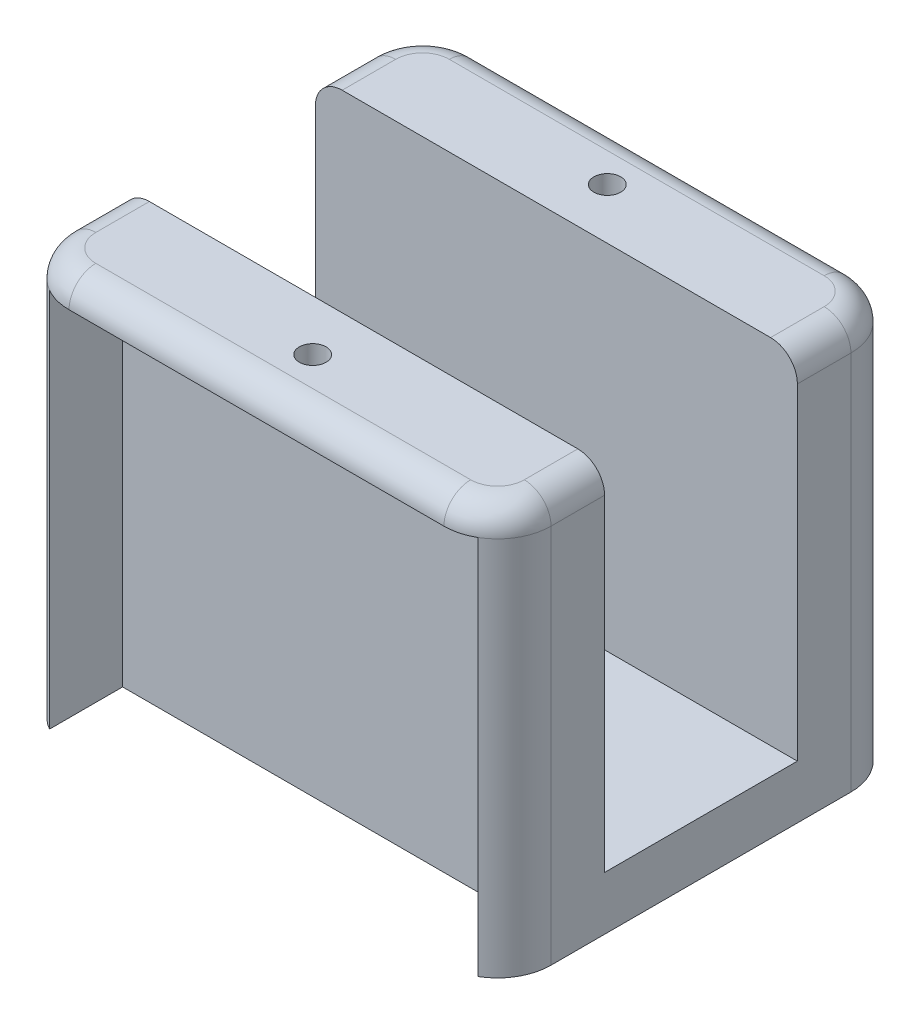
ISO-10303-21;
HEADER;
FILE_DESCRIPTION(('STEP AP214'),'2;1');
FILE_NAME('part.step','',(''),(''),'','','');
FILE_SCHEMA(('AUTOMOTIVE_DESIGN { 1 0 10303 214 1 1 1 1 }'));
ENDSEC;
DATA;
#1=APPLICATION_CONTEXT('core data for automotive mechanical design processes');
#2=APPLICATION_PROTOCOL_DEFINITION('international standard','automotive_design',2000,#1);
#3=PRODUCT_CONTEXT('',#1,'mechanical');
#4=PRODUCT('Part','Part','',(#3));
#5=PRODUCT_RELATED_PRODUCT_CATEGORY('part','',(#4));
#6=PRODUCT_DEFINITION_FORMATION('','',#4);
#7=PRODUCT_DEFINITION_CONTEXT('part definition',#1,'design');
#8=PRODUCT_DEFINITION('design','',#6,#7);
#9=PRODUCT_DEFINITION_SHAPE('','',#8);
#10=(LENGTH_UNIT() NAMED_UNIT(*) SI_UNIT(.MILLI.,.METRE.));
#11=(NAMED_UNIT(*) PLANE_ANGLE_UNIT() SI_UNIT($,.RADIAN.));
#12=(NAMED_UNIT(*) SI_UNIT($,.STERADIAN.) SOLID_ANGLE_UNIT());
#13=UNCERTAINTY_MEASURE_WITH_UNIT(LENGTH_MEASURE(1.E-05),#10,'distance_accuracy_value','');
#14=(GEOMETRIC_REPRESENTATION_CONTEXT(3) GLOBAL_UNCERTAINTY_ASSIGNED_CONTEXT((#13)) GLOBAL_UNIT_ASSIGNED_CONTEXT((#10,
#11,#12)) REPRESENTATION_CONTEXT('',''));
#15=CARTESIAN_POINT('',(0.,0.,0.));
#16=DIRECTION('',(0.,0.,1.));
#17=DIRECTION('',(1.,0.,0.));
#18=AXIS2_PLACEMENT_3D('',#15,#16,#17);
#19=CARTESIAN_POINT('',(0.,76.,0.));
#20=DIRECTION('',(0.,1.,0.));
#21=DIRECTION('',(0.,0.,1.));
#22=AXIS2_PLACEMENT_3D('',#19,#20,#21);
#23=PLANE('',#22);
#24=CARTESIAN_POINT('',(0.,76.,27.5));
#25=DIRECTION('',(0.,1.,0.));
#26=DIRECTION('',(0.,0.,1.));
#27=AXIS2_PLACEMENT_3D('',#24,#25,#26);
#28=CIRCLE('',#27,2.5);
#29=CARTESIAN_POINT('',(0.,76.,30.));
#30=VERTEX_POINT('',#29);
#31=EDGE_CURVE('E463',#30,#30,#28,.T.);
#32=ORIENTED_EDGE('',*,*,#31,.F.);
#33=EDGE_LOOP('',(#32));
#34=FACE_BOUND('',#33,.T.);
#35=CARTESIAN_POINT('',(35.,76.,28.));
#36=DIRECTION('',(0.,1.,0.));
#37=DIRECTION('',(0.,0.,1.));
#38=AXIS2_PLACEMENT_3D('',#35,#36,#37);
#39=CIRCLE('',#38,5.);
#40=CARTESIAN_POINT('',(35.,76.,33.));
#41=VERTEX_POINT('',#40);
#42=CARTESIAN_POINT('',(40.,76.,28.));
#43=VERTEX_POINT('',#42);
#44=EDGE_CURVE('E428',#41,#43,#39,.T.);
#45=ORIENTED_EDGE('',*,*,#44,.T.);
#46=DIRECTION('',(0.,0.,-1.));
#47=VECTOR('',#46,1.);
#48=CARTESIAN_POINT('',(40.,76.,18.));
#49=LINE('',#48,#47);
#50=CARTESIAN_POINT('',(40.,76.,18.));
#51=VERTEX_POINT('',#50);
#52=EDGE_CURVE('E431',#43,#51,#49,.T.);
#53=ORIENTED_EDGE('',*,*,#52,.T.);
#54=DIRECTION('',(1.,0.,0.));
#55=VECTOR('',#54,1.);
#56=CARTESIAN_POINT('',(-45.,76.,18.));
#57=LINE('',#56,#55);
#58=CARTESIAN_POINT('',(-40.,76.,18.));
#59=VERTEX_POINT('',#58);
#60=EDGE_CURVE('E295',#59,#51,#57,.T.);
#61=ORIENTED_EDGE('',*,*,#60,.F.);
#62=DIRECTION('',(0.,0.,1.));
#63=VECTOR('',#62,1.);
#64=CARTESIAN_POINT('',(-40.,76.,28.));
#65=LINE('',#64,#63);
#66=CARTESIAN_POINT('',(-40.,76.,28.));
#67=VERTEX_POINT('',#66);
#68=EDGE_CURVE('E419',#59,#67,#65,.T.);
#69=ORIENTED_EDGE('',*,*,#68,.T.);
#70=CARTESIAN_POINT('',(-35.,76.,28.));
#71=DIRECTION('',(0.,1.,0.));
#72=DIRECTION('',(0.,0.,1.));
#73=AXIS2_PLACEMENT_3D('',#70,#71,#72);
#74=CIRCLE('',#73,5.);
#75=CARTESIAN_POINT('',(-35.,76.,33.));
#76=VERTEX_POINT('',#75);
#77=EDGE_CURVE('E422',#67,#76,#74,.T.);
#78=ORIENTED_EDGE('',*,*,#77,.T.);
#79=DIRECTION('',(-1.,0.,0.));
#80=VECTOR('',#79,1.);
#81=CARTESIAN_POINT('',(0.,76.,33.));
#82=LINE('',#81,#80);
#83=EDGE_CURVE('E425',#76,#41,#82,.F.);
#84=ORIENTED_EDGE('',*,*,#83,.T.);
#85=EDGE_LOOP('',(#45,#53,#61,#69,#78,#84));
#86=FACE_BOUND('',#85,.T.);
#87=ADVANCED_FACE('F40',(#34,#86),#23,.T.);
#88=CARTESIAN_POINT('',(45.,76.,-33.));
#89=DIRECTION('',(-1.,0.,0.));
#90=DIRECTION('',(0.,0.,1.));
#91=AXIS2_PLACEMENT_3D('',#88,#89,#90);
#92=PLANE('',#91);
#93=DIRECTION('',(0.,-1.,0.));
#94=VECTOR('',#93,1.);
#95=CARTESIAN_POINT('',(45.,76.,-28.));
#96=LINE('',#95,#94);
#97=CARTESIAN_POINT('',(45.,0.,-28.));
#98=VERTEX_POINT('',#97);
#99=CARTESIAN_POINT('',(45.,71.,-28.));
#100=VERTEX_POINT('',#99);
#101=EDGE_CURVE('E368',#98,#100,#96,.F.);
#102=ORIENTED_EDGE('',*,*,#101,.T.);
#103=DIRECTION('',(0.,0.,-1.));
#104=VECTOR('',#103,1.);
#105=CARTESIAN_POINT('',(45.,71.,-18.));
#106=LINE('',#105,#104);
#107=CARTESIAN_POINT('',(45.,71.,-18.));
#108=VERTEX_POINT('',#107);
#109=EDGE_CURVE('E404',#100,#108,#106,.F.);
#110=ORIENTED_EDGE('',*,*,#109,.T.);
#111=DIRECTION('',(0.,1.,0.));
#112=VECTOR('',#111,1.);
#113=CARTESIAN_POINT('',(45.,9.99999999999999,-18.));
#114=LINE('',#113,#112);
#115=CARTESIAN_POINT('',(45.,9.99999999999999,-18.));
#116=VERTEX_POINT('',#115);
#117=EDGE_CURVE('E306',#116,#108,#114,.T.);
#118=ORIENTED_EDGE('',*,*,#117,.F.);
#119=DIRECTION('',(0.,0.,-1.));
#120=VECTOR('',#119,1.);
#121=CARTESIAN_POINT('',(45.,9.99999999999999,-18.));
#122=LINE('',#121,#120);
#123=CARTESIAN_POINT('',(45.,9.99999999999999,18.));
#124=VERTEX_POINT('',#123);
#125=EDGE_CURVE('E290',#124,#116,#122,.T.);
#126=ORIENTED_EDGE('',*,*,#125,.F.);
#127=DIRECTION('',(0.,1.,0.));
#128=VECTOR('',#127,1.);
#129=CARTESIAN_POINT('',(45.,9.99999999999999,18.));
#130=LINE('',#129,#128);
#131=CARTESIAN_POINT('',(45.,71.,18.));
#132=VERTEX_POINT('',#131);
#133=EDGE_CURVE('E313',#124,#132,#130,.T.);
#134=ORIENTED_EDGE('',*,*,#133,.T.);
#135=DIRECTION('',(0.,0.,-1.));
#136=VECTOR('',#135,1.);
#137=CARTESIAN_POINT('',(45.,71.,28.));
#138=LINE('',#137,#136);
#139=CARTESIAN_POINT('',(45.,71.,28.));
#140=VERTEX_POINT('',#139);
#141=EDGE_CURVE('E401',#132,#140,#138,.F.);
#142=ORIENTED_EDGE('',*,*,#141,.T.);
#143=DIRECTION('',(0.,1.,0.));
#144=VECTOR('',#143,1.);
#145=CARTESIAN_POINT('',(45.,0.,28.));
#146=LINE('',#145,#144);
#147=CARTESIAN_POINT('',(45.,0.,28.));
#148=VERTEX_POINT('',#147);
#149=EDGE_CURVE('E365',#140,#148,#146,.F.);
#150=ORIENTED_EDGE('',*,*,#149,.T.);
#151=DIRECTION('',(0.,0.,-1.));
#152=VECTOR('',#151,1.);
#153=CARTESIAN_POINT('',(45.,0.,-33.));
#154=LINE('',#153,#152);
#155=EDGE_CURVE('E317',#148,#98,#154,.T.);
#156=ORIENTED_EDGE('',*,*,#155,.T.);
#157=EDGE_LOOP('',(#102,#110,#118,#126,#134,#142,#150,#156));
#158=FACE_BOUND('',#157,.T.);
#159=ADVANCED_FACE('F501',(#158),#92,.F.);
#160=CARTESIAN_POINT('',(-45.,76.,-33.));
#161=DIRECTION('',(1.,0.,0.));
#162=DIRECTION('',(0.,0.,-1.));
#163=AXIS2_PLACEMENT_3D('',#160,#161,#162);
#164=PLANE('',#163);
#165=DIRECTION('',(0.,1.,0.));
#166=VECTOR('',#165,1.);
#167=CARTESIAN_POINT('',(-45.,9.99999999999999,-18.));
#168=LINE('',#167,#166);
#169=CARTESIAN_POINT('',(-45.,9.99999999999999,-18.));
#170=VERTEX_POINT('',#169);
#171=CARTESIAN_POINT('',(-45.,71.,-18.));
#172=VERTEX_POINT('',#171);
#173=EDGE_CURVE('E321',#170,#172,#168,.T.);
#174=ORIENTED_EDGE('',*,*,#173,.T.);
#175=DIRECTION('',(0.,0.,1.));
#176=VECTOR('',#175,1.);
#177=CARTESIAN_POINT('',(-45.,71.,-28.));
#178=LINE('',#177,#176);
#179=CARTESIAN_POINT('',(-45.,71.,-28.));
#180=VERTEX_POINT('',#179);
#181=EDGE_CURVE('E11',#172,#180,#178,.F.);
#182=ORIENTED_EDGE('',*,*,#181,.T.);
#183=DIRECTION('',(0.,1.,0.));
#184=VECTOR('',#183,1.);
#185=CARTESIAN_POINT('',(-45.,0.,-28.));
#186=LINE('',#185,#184);
#187=CARTESIAN_POINT('',(-45.,0.,-28.));
#188=VERTEX_POINT('',#187);
#189=EDGE_CURVE('E338',#180,#188,#186,.F.);
#190=ORIENTED_EDGE('',*,*,#189,.T.);
#191=DIRECTION('',(0.,0.,1.));
#192=VECTOR('',#191,1.);
#193=CARTESIAN_POINT('',(-45.,0.,-33.));
#194=LINE('',#193,#192);
#195=CARTESIAN_POINT('',(-45.,0.,28.));
#196=VERTEX_POINT('',#195);
#197=EDGE_CURVE('E331',#188,#196,#194,.T.);
#198=ORIENTED_EDGE('',*,*,#197,.T.);
#199=DIRECTION('',(0.,-1.,0.));
#200=VECTOR('',#199,1.);
#201=CARTESIAN_POINT('',(-45.,76.,28.));
#202=LINE('',#201,#200);
#203=CARTESIAN_POINT('',(-45.,71.,28.));
#204=VERTEX_POINT('',#203);
#205=EDGE_CURVE('E335',#196,#204,#202,.F.);
#206=ORIENTED_EDGE('',*,*,#205,.T.);
#207=DIRECTION('',(0.,0.,1.));
#208=VECTOR('',#207,1.);
#209=CARTESIAN_POINT('',(-45.,71.,18.));
#210=LINE('',#209,#208);
#211=CARTESIAN_POINT('',(-45.,71.,18.));
#212=VERTEX_POINT('',#211);
#213=EDGE_CURVE('E50',#204,#212,#210,.F.);
#214=ORIENTED_EDGE('',*,*,#213,.T.);
#215=DIRECTION('',(0.,1.,0.));
#216=VECTOR('',#215,1.);
#217=CARTESIAN_POINT('',(-45.,9.99999999999999,18.));
#218=LINE('',#217,#216);
#219=CARTESIAN_POINT('',(-45.,9.99999999999999,18.));
#220=VERTEX_POINT('',#219);
#221=EDGE_CURVE('E318',#220,#212,#218,.T.);
#222=ORIENTED_EDGE('',*,*,#221,.F.);
#223=DIRECTION('',(0.,0.,1.));
#224=VECTOR('',#223,1.);
#225=CARTESIAN_POINT('',(-45.,9.99999999999999,-18.));
#226=LINE('',#225,#224);
#227=EDGE_CURVE('E299',#170,#220,#226,.T.);
#228=ORIENTED_EDGE('',*,*,#227,.F.);
#229=EDGE_LOOP('',(#174,#182,#190,#198,#206,#214,#222,#228));
#230=FACE_BOUND('',#229,.T.);
#231=ADVANCED_FACE('F507',(#230),#164,.F.);
#232=CARTESIAN_POINT('',(0.,76.,-27.5));
#233=DIRECTION('',(0.,1.,0.));
#234=DIRECTION('',(0.,0.,1.));
#235=AXIS2_PLACEMENT_3D('',#232,#233,#234);
#236=CIRCLE('',#235,2.5);
#237=CARTESIAN_POINT('',(0.,76.,-25.));
#238=VERTEX_POINT('',#237);
#239=EDGE_CURVE('E580',#238,#238,#236,.T.);
#240=ORIENTED_EDGE('',*,*,#239,.F.);
#241=EDGE_LOOP('',(#240));
#242=FACE_BOUND('',#241,.T.);
#243=DIRECTION('',(-1.,0.,0.));
#244=VECTOR('',#243,1.);
#245=CARTESIAN_POINT('',(-45.,76.,-18.));
#246=LINE('',#245,#244);
#247=CARTESIAN_POINT('',(40.,76.,-18.));
#248=VERTEX_POINT('',#247);
#249=CARTESIAN_POINT('',(-40.,76.,-18.));
#250=VERTEX_POINT('',#249);
#251=EDGE_CURVE('E278',#248,#250,#246,.T.);
#252=ORIENTED_EDGE('',*,*,#251,.F.);
#253=DIRECTION('',(0.,0.,-1.));
#254=VECTOR('',#253,1.);
#255=CARTESIAN_POINT('',(40.,76.,-28.));
#256=LINE('',#255,#254);
#257=CARTESIAN_POINT('',(40.,76.,-28.));
#258=VERTEX_POINT('',#257);
#259=EDGE_CURVE('E397',#248,#258,#256,.T.);
#260=ORIENTED_EDGE('',*,*,#259,.T.);
#261=CARTESIAN_POINT('',(35.,76.,-28.));
#262=DIRECTION('',(0.,1.,0.));
#263=DIRECTION('',(0.,0.,1.));
#264=AXIS2_PLACEMENT_3D('',#261,#262,#263);
#265=CIRCLE('',#264,5.);
#266=CARTESIAN_POINT('',(35.,76.,-33.));
#267=VERTEX_POINT('',#266);
#268=EDGE_CURVE('E394',#258,#267,#265,.T.);
#269=ORIENTED_EDGE('',*,*,#268,.T.);
#270=DIRECTION('',(1.,0.,0.));
#271=VECTOR('',#270,1.);
#272=CARTESIAN_POINT('',(0.,76.,-33.));
#273=LINE('',#272,#271);
#274=CARTESIAN_POINT('',(-35.,76.,-33.));
#275=VERTEX_POINT('',#274);
#276=EDGE_CURVE('E391',#267,#275,#273,.F.);
#277=ORIENTED_EDGE('',*,*,#276,.T.);
#278=CARTESIAN_POINT('',(-35.,76.,-28.));
#279=DIRECTION('',(0.,1.,0.));
#280=DIRECTION('',(0.,0.,1.));
#281=AXIS2_PLACEMENT_3D('',#278,#279,#280);
#282=CIRCLE('',#281,5.);
#283=CARTESIAN_POINT('',(-40.,76.,-28.));
#284=VERTEX_POINT('',#283);
#285=EDGE_CURVE('E388',#275,#284,#282,.T.);
#286=ORIENTED_EDGE('',*,*,#285,.T.);
#287=DIRECTION('',(0.,0.,1.));
#288=VECTOR('',#287,1.);
#289=CARTESIAN_POINT('',(-40.,76.,-18.));
#290=LINE('',#289,#288);
#291=EDGE_CURVE('E385',#284,#250,#290,.T.);
#292=ORIENTED_EDGE('',*,*,#291,.T.);
#293=EDGE_LOOP('',(#252,#260,#269,#277,#286,#292));
#294=FACE_BOUND('',#293,.T.);
#295=ADVANCED_FACE('F547',(#242,#294),#23,.T.);
#296=CARTESIAN_POINT('',(0.,0.,0.));
#297=DIRECTION('',(0.,1.,0.));
#298=DIRECTION('',(0.,0.,1.));
#299=AXIS2_PLACEMENT_3D('',#296,#297,#298);
#300=PLANE('',#299);
#301=ORIENTED_EDGE('',*,*,#197,.F.);
#302=CARTESIAN_POINT('',(-35.,0.,-28.));
#303=DIRECTION('',(0.,1.,0.));
#304=DIRECTION('',(0.,0.,1.));
#305=AXIS2_PLACEMENT_3D('',#302,#303,#304);
#306=CIRCLE('',#305,10.);
#307=CARTESIAN_POINT('',(-40.,0.,-36.6602540378444));
#308=VERTEX_POINT('',#307);
#309=EDGE_CURVE('E350',#188,#308,#306,.F.);
#310=ORIENTED_EDGE('',*,*,#309,.T.);
#311=DIRECTION('',(0.,0.,-1.));
#312=VECTOR('',#311,1.);
#313=CARTESIAN_POINT('',(-40.,0.,-23.));
#314=LINE('',#313,#312);
#315=CARTESIAN_POINT('',(-40.,0.,-23.));
#316=VERTEX_POINT('',#315);
#317=EDGE_CURVE('E217',#316,#308,#314,.T.);
#318=ORIENTED_EDGE('',*,*,#317,.F.);
#319=DIRECTION('',(-1.,0.,0.));
#320=VECTOR('',#319,1.);
#321=CARTESIAN_POINT('',(40.,0.,-23.));
#322=LINE('',#321,#320);
#323=CARTESIAN_POINT('',(40.,0.,-23.));
#324=VERTEX_POINT('',#323);
#325=EDGE_CURVE('E224',#324,#316,#322,.T.);
#326=ORIENTED_EDGE('',*,*,#325,.F.);
#327=DIRECTION('',(0.,0.,-1.));
#328=VECTOR('',#327,1.);
#329=CARTESIAN_POINT('',(40.,0.,-23.));
#330=LINE('',#329,#328);
#331=CARTESIAN_POINT('',(40.,0.,-36.6602540378444));
#332=VERTEX_POINT('',#331);
#333=EDGE_CURVE('E205',#324,#332,#330,.T.);
#334=ORIENTED_EDGE('',*,*,#333,.T.);
#335=CARTESIAN_POINT('',(35.,0.,-28.));
#336=DIRECTION('',(0.,1.,0.));
#337=DIRECTION('',(0.,0.,1.));
#338=AXIS2_PLACEMENT_3D('',#335,#336,#337);
#339=CIRCLE('',#338,10.);
#340=EDGE_CURVE('E347',#332,#98,#339,.F.);
#341=ORIENTED_EDGE('',*,*,#340,.T.);
#342=ORIENTED_EDGE('',*,*,#155,.F.);
#343=CARTESIAN_POINT('',(35.,0.,28.));
#344=DIRECTION('',(0.,1.,0.));
#345=DIRECTION('',(0.,0.,1.));
#346=AXIS2_PLACEMENT_3D('',#343,#344,#345);
#347=CIRCLE('',#346,10.);
#348=CARTESIAN_POINT('',(40.,0.,36.6602540378444));
#349=VERTEX_POINT('',#348);
#350=EDGE_CURVE('E341',#148,#349,#347,.F.);
#351=ORIENTED_EDGE('',*,*,#350,.T.);
#352=DIRECTION('',(0.,0.,1.));
#353=VECTOR('',#352,1.);
#354=CARTESIAN_POINT('',(40.,0.,23.));
#355=LINE('',#354,#353);
#356=CARTESIAN_POINT('',(40.,0.,23.));
#357=VERTEX_POINT('',#356);
#358=EDGE_CURVE('E283',#357,#349,#355,.T.);
#359=ORIENTED_EDGE('',*,*,#358,.F.);
#360=DIRECTION('',(1.,0.,0.));
#361=VECTOR('',#360,1.);
#362=CARTESIAN_POINT('',(-40.,0.,23.));
#363=LINE('',#362,#361);
#364=CARTESIAN_POINT('',(-40.,0.,23.));
#365=VERTEX_POINT('',#364);
#366=EDGE_CURVE('E259',#365,#357,#363,.T.);
#367=ORIENTED_EDGE('',*,*,#366,.F.);
#368=DIRECTION('',(0.,0.,1.));
#369=VECTOR('',#368,1.);
#370=CARTESIAN_POINT('',(-40.,0.,23.));
#371=LINE('',#370,#369);
#372=CARTESIAN_POINT('',(-40.,0.,36.6602540378444));
#373=VERTEX_POINT('',#372);
#374=EDGE_CURVE('E271',#365,#373,#371,.T.);
#375=ORIENTED_EDGE('',*,*,#374,.T.);
#376=CARTESIAN_POINT('',(-35.,0.,28.));
#377=DIRECTION('',(0.,1.,0.));
#378=DIRECTION('',(0.,0.,1.));
#379=AXIS2_PLACEMENT_3D('',#376,#377,#378);
#380=CIRCLE('',#379,10.);
#381=EDGE_CURVE('E344',#373,#196,#380,.F.);
#382=ORIENTED_EDGE('',*,*,#381,.T.);
#383=EDGE_LOOP('',(#301,#310,#318,#326,#334,#341,#342,#351,#359,#367,#375,#382));
#384=FACE_BOUND('',#383,.T.);
#385=ADVANCED_FACE('F231',(#384),#300,.F.);
#386=CARTESIAN_POINT('',(-45.,9.99999999999999,18.));
#387=DIRECTION('',(0.,0.,1.));
#388=DIRECTION('',(1.,0.,0.));
#389=AXIS2_PLACEMENT_3D('',#386,#387,#388);
#390=PLANE('',#389);
#391=ORIENTED_EDGE('',*,*,#60,.T.);
#392=CARTESIAN_POINT('',(40.,71.,18.));
#393=DIRECTION('',(0.,0.,1.));
#394=DIRECTION('',(1.,0.,0.));
#395=AXIS2_PLACEMENT_3D('',#392,#393,#394);
#396=CIRCLE('',#395,5.);
#397=EDGE_CURVE('E438',#51,#132,#396,.F.);
#398=ORIENTED_EDGE('',*,*,#397,.T.);
#399=ORIENTED_EDGE('',*,*,#133,.F.);
#400=DIRECTION('',(1.,0.,0.));
#401=VECTOR('',#400,1.);
#402=CARTESIAN_POINT('',(-45.,9.99999999999999,18.));
#403=LINE('',#402,#401);
#404=EDGE_CURVE('E302',#220,#124,#403,.T.);
#405=ORIENTED_EDGE('',*,*,#404,.F.);
#406=ORIENTED_EDGE('',*,*,#221,.T.);
#407=CARTESIAN_POINT('',(-40.,71.,18.));
#408=DIRECTION('',(0.,0.,1.));
#409=DIRECTION('',(1.,0.,0.));
#410=AXIS2_PLACEMENT_3D('',#407,#408,#409);
#411=CIRCLE('',#410,5.);
#412=EDGE_CURVE('E435',#212,#59,#411,.F.);
#413=ORIENTED_EDGE('',*,*,#412,.T.);
#414=EDGE_LOOP('',(#391,#398,#399,#405,#406,#413));
#415=FACE_BOUND('',#414,.T.);
#416=ADVANCED_FACE('F490',(#415),#390,.F.);
#417=CARTESIAN_POINT('',(-45.,9.99999999999999,-18.));
#418=DIRECTION('',(0.,0.,-1.));
#419=DIRECTION('',(-1.,0.,0.));
#420=AXIS2_PLACEMENT_3D('',#417,#418,#419);
#421=PLANE('',#420);
#422=ORIENTED_EDGE('',*,*,#117,.T.);
#423=CARTESIAN_POINT('',(40.,71.,-18.));
#424=DIRECTION('',(0.,0.,-1.));
#425=DIRECTION('',(-1.,0.,0.));
#426=AXIS2_PLACEMENT_3D('',#423,#424,#425);
#427=CIRCLE('',#426,5.);
#428=EDGE_CURVE('E410',#108,#248,#427,.F.);
#429=ORIENTED_EDGE('',*,*,#428,.T.);
#430=ORIENTED_EDGE('',*,*,#251,.T.);
#431=CARTESIAN_POINT('',(-40.,71.,-18.));
#432=DIRECTION('',(0.,0.,-1.));
#433=DIRECTION('',(-1.,0.,0.));
#434=AXIS2_PLACEMENT_3D('',#431,#432,#433);
#435=CIRCLE('',#434,5.);
#436=EDGE_CURVE('E407',#250,#172,#435,.F.);
#437=ORIENTED_EDGE('',*,*,#436,.T.);
#438=ORIENTED_EDGE('',*,*,#173,.F.);
#439=DIRECTION('',(-1.,0.,0.));
#440=VECTOR('',#439,1.);
#441=CARTESIAN_POINT('',(-45.,9.99999999999999,-18.));
#442=LINE('',#441,#440);
#443=EDGE_CURVE('E294',#116,#170,#442,.T.);
#444=ORIENTED_EDGE('',*,*,#443,.F.);
#445=EDGE_LOOP('',(#422,#429,#430,#437,#438,#444));
#446=FACE_BOUND('',#445,.T.);
#447=ADVANCED_FACE('F544',(#446),#421,.F.);
#448=CARTESIAN_POINT('',(0.,9.99999999999999,0.));
#449=DIRECTION('',(0.,1.,0.));
#450=DIRECTION('',(0.,0.,1.));
#451=AXIS2_PLACEMENT_3D('',#448,#449,#450);
#452=PLANE('',#451);
#453=ORIENTED_EDGE('',*,*,#125,.T.);
#454=ORIENTED_EDGE('',*,*,#443,.T.);
#455=ORIENTED_EDGE('',*,*,#227,.T.);
#456=ORIENTED_EDGE('',*,*,#404,.T.);
#457=EDGE_LOOP('',(#453,#454,#455,#456));
#458=FACE_BOUND('',#457,.T.);
#459=ADVANCED_FACE('F505',(#458),#452,.T.);
#460=CARTESIAN_POINT('',(-40.,71.,23.));
#461=DIRECTION('',(-1.,0.,0.));
#462=DIRECTION('',(0.,-1.,0.));
#463=AXIS2_PLACEMENT_3D('',#460,#461,#462);
#464=PLANE('',#463);
#465=DIRECTION('',(0.,0.,1.));
#466=VECTOR('',#465,1.);
#467=CARTESIAN_POINT('',(-40.,71.,23.));
#468=LINE('',#467,#466);
#469=CARTESIAN_POINT('',(-40.,71.,23.));
#470=VERTEX_POINT('',#469);
#471=CARTESIAN_POINT('',(-40.,71.,36.6602540378444));
#472=VERTEX_POINT('',#471);
#473=EDGE_CURVE('E274',#470,#472,#468,.T.);
#474=ORIENTED_EDGE('',*,*,#473,.T.);
#475=DIRECTION('',(0.,1.,0.));
#476=VECTOR('',#475,1.);
#477=CARTESIAN_POINT('',(-40.,71.,36.6602540378444));
#478=LINE('',#477,#476);
#479=EDGE_CURVE('E378',#472,#373,#478,.F.);
#480=ORIENTED_EDGE('',*,*,#479,.T.);
#481=ORIENTED_EDGE('',*,*,#374,.F.);
#482=DIRECTION('',(0.,-1.,0.));
#483=VECTOR('',#482,1.);
#484=CARTESIAN_POINT('',(-40.,71.,23.));
#485=LINE('',#484,#483);
#486=EDGE_CURVE('E255',#470,#365,#485,.T.);
#487=ORIENTED_EDGE('',*,*,#486,.F.);
#488=EDGE_LOOP('',(#474,#480,#481,#487));
#489=FACE_BOUND('',#488,.T.);
#490=ADVANCED_FACE('F625',(#489),#464,.F.);
#491=CARTESIAN_POINT('',(-40.,71.,23.));
#492=DIRECTION('',(0.,1.,0.));
#493=DIRECTION('',(0.,0.,1.));
#494=AXIS2_PLACEMENT_3D('',#491,#492,#493);
#495=PLANE('',#494);
#496=CARTESIAN_POINT('',(0.,71.,27.5));
#497=DIRECTION('',(0.,1.,0.));
#498=DIRECTION('',(0.,0.,1.));
#499=AXIS2_PLACEMENT_3D('',#496,#497,#498);
#500=CIRCLE('',#499,2.5);
#501=CARTESIAN_POINT('',(0.,71.,30.));
#502=VERTEX_POINT('',#501);
#503=EDGE_CURVE('E583',#502,#502,#500,.T.);
#504=ORIENTED_EDGE('',*,*,#503,.T.);
#505=EDGE_LOOP('',(#504));
#506=FACE_BOUND('',#505,.T.);
#507=DIRECTION('',(-1.,0.,0.));
#508=VECTOR('',#507,1.);
#509=CARTESIAN_POINT('',(-40.,71.,38.));
#510=LINE('',#509,#508);
#511=CARTESIAN_POINT('',(35.,71.,38.));
#512=VERTEX_POINT('',#511);
#513=CARTESIAN_POINT('',(-35.,71.,38.));
#514=VERTEX_POINT('',#513);
#515=EDGE_CURVE('E248',#512,#514,#510,.T.);
#516=ORIENTED_EDGE('',*,*,#515,.T.);
#517=CARTESIAN_POINT('',(-35.,71.,28.));
#518=DIRECTION('',(0.,1.,0.));
#519=DIRECTION('',(0.,0.,1.));
#520=AXIS2_PLACEMENT_3D('',#517,#518,#519);
#521=CIRCLE('',#520,10.);
#522=EDGE_CURVE('E375',#514,#472,#521,.F.);
#523=ORIENTED_EDGE('',*,*,#522,.T.);
#524=ORIENTED_EDGE('',*,*,#473,.F.);
#525=DIRECTION('',(-1.,0.,0.));
#526=VECTOR('',#525,1.);
#527=CARTESIAN_POINT('',(-40.,71.,23.));
#528=LINE('',#527,#526);
#529=CARTESIAN_POINT('',(40.,71.,23.));
#530=VERTEX_POINT('',#529);
#531=EDGE_CURVE('E267',#530,#470,#528,.T.);
#532=ORIENTED_EDGE('',*,*,#531,.F.);
#533=DIRECTION('',(0.,0.,1.));
#534=VECTOR('',#533,1.);
#535=CARTESIAN_POINT('',(40.,71.,23.));
#536=LINE('',#535,#534);
#537=CARTESIAN_POINT('',(40.,71.,36.6602540378444));
#538=VERTEX_POINT('',#537);
#539=EDGE_CURVE('E279',#530,#538,#536,.T.);
#540=ORIENTED_EDGE('',*,*,#539,.T.);
#541=CARTESIAN_POINT('',(35.,71.,28.));
#542=DIRECTION('',(0.,1.,0.));
#543=DIRECTION('',(0.,0.,1.));
#544=AXIS2_PLACEMENT_3D('',#541,#542,#543);
#545=CIRCLE('',#544,10.);
#546=EDGE_CURVE('E372',#538,#512,#545,.F.);
#547=ORIENTED_EDGE('',*,*,#546,.T.);
#548=EDGE_LOOP('',(#516,#523,#524,#532,#540,#547));
#549=FACE_BOUND('',#548,.T.);
#550=ADVANCED_FACE('F622',(#506,#549),#495,.F.);
#551=CARTESIAN_POINT('',(40.,71.,23.));
#552=DIRECTION('',(1.,0.,0.));
#553=DIRECTION('',(0.,1.,0.));
#554=AXIS2_PLACEMENT_3D('',#551,#552,#553);
#555=PLANE('',#554);
#556=ORIENTED_EDGE('',*,*,#358,.T.);
#557=DIRECTION('',(0.,-1.,0.));
#558=VECTOR('',#557,1.);
#559=CARTESIAN_POINT('',(40.,0.,36.6602540378444));
#560=LINE('',#559,#558);
#561=EDGE_CURVE('E381',#349,#538,#560,.F.);
#562=ORIENTED_EDGE('',*,*,#561,.T.);
#563=ORIENTED_EDGE('',*,*,#539,.F.);
#564=DIRECTION('',(0.,1.,0.));
#565=VECTOR('',#564,1.);
#566=CARTESIAN_POINT('',(40.,71.,23.));
#567=LINE('',#566,#565);
#568=EDGE_CURVE('E263',#357,#530,#567,.T.);
#569=ORIENTED_EDGE('',*,*,#568,.F.);
#570=EDGE_LOOP('',(#556,#562,#563,#569));
#571=FACE_BOUND('',#570,.T.);
#572=ADVANCED_FACE('F620',(#571),#555,.F.);
#573=CARTESIAN_POINT('',(0.,0.,23.));
#574=DIRECTION('',(0.,0.,1.));
#575=DIRECTION('',(1.,0.,0.));
#576=AXIS2_PLACEMENT_3D('',#573,#574,#575);
#577=PLANE('',#576);
#578=ORIENTED_EDGE('',*,*,#486,.T.);
#579=ORIENTED_EDGE('',*,*,#366,.T.);
#580=ORIENTED_EDGE('',*,*,#568,.T.);
#581=ORIENTED_EDGE('',*,*,#531,.T.);
#582=EDGE_LOOP('',(#578,#579,#580,#581));
#583=FACE_BOUND('',#582,.T.);
#584=ADVANCED_FACE('F617',(#583),#577,.T.);
#585=CARTESIAN_POINT('',(40.,71.,-23.));
#586=DIRECTION('',(1.,0.,0.));
#587=DIRECTION('',(0.,1.,0.));
#588=AXIS2_PLACEMENT_3D('',#585,#586,#587);
#589=PLANE('',#588);
#590=DIRECTION('',(0.,0.,-1.));
#591=VECTOR('',#590,1.);
#592=CARTESIAN_POINT('',(40.,71.,-23.));
#593=LINE('',#592,#591);
#594=CARTESIAN_POINT('',(40.,71.,-23.));
#595=VERTEX_POINT('',#594);
#596=CARTESIAN_POINT('',(40.,71.,-36.6602540378444));
#597=VERTEX_POINT('',#596);
#598=EDGE_CURVE('E245',#595,#597,#593,.T.);
#599=ORIENTED_EDGE('',*,*,#598,.T.);
#600=DIRECTION('',(0.,1.,0.));
#601=VECTOR('',#600,1.);
#602=CARTESIAN_POINT('',(40.,71.,-36.6602540378444));
#603=LINE('',#602,#601);
#604=EDGE_CURVE('E212',#597,#332,#603,.F.);
#605=ORIENTED_EDGE('',*,*,#604,.T.);
#606=ORIENTED_EDGE('',*,*,#333,.F.);
#607=DIRECTION('',(0.,-1.,0.));
#608=VECTOR('',#607,1.);
#609=CARTESIAN_POINT('',(40.,71.,-23.));
#610=LINE('',#609,#608);
#611=EDGE_CURVE('E209',#595,#324,#610,.T.);
#612=ORIENTED_EDGE('',*,*,#611,.F.);
#613=EDGE_LOOP('',(#599,#605,#606,#612));
#614=FACE_BOUND('',#613,.T.);
#615=ADVANCED_FACE('F208',(#614),#589,.F.);
#616=CARTESIAN_POINT('',(40.,71.,-23.));
#617=DIRECTION('',(0.,1.,0.));
#618=DIRECTION('',(0.,0.,1.));
#619=AXIS2_PLACEMENT_3D('',#616,#617,#618);
#620=PLANE('',#619);
#621=CARTESIAN_POINT('',(0.,71.,-27.5));
#622=DIRECTION('',(0.,1.,0.));
#623=DIRECTION('',(0.,0.,1.));
#624=AXIS2_PLACEMENT_3D('',#621,#622,#623);
#625=CIRCLE('',#624,2.5);
#626=CARTESIAN_POINT('',(0.,71.,-25.));
#627=VERTEX_POINT('',#626);
#628=EDGE_CURVE('E244',#627,#627,#625,.T.);
#629=ORIENTED_EDGE('',*,*,#628,.T.);
#630=EDGE_LOOP('',(#629));
#631=FACE_BOUND('',#630,.T.);
#632=DIRECTION('',(0.,0.,-1.));
#633=VECTOR('',#632,1.);
#634=CARTESIAN_POINT('',(-40.,71.,-23.));
#635=LINE('',#634,#633);
#636=CARTESIAN_POINT('',(-40.,71.,-23.));
#637=VERTEX_POINT('',#636);
#638=CARTESIAN_POINT('',(-40.,71.,-36.6602540378444));
#639=VERTEX_POINT('',#638);
#640=EDGE_CURVE('E249',#637,#639,#635,.T.);
#641=ORIENTED_EDGE('',*,*,#640,.T.);
#642=CARTESIAN_POINT('',(-35.,71.,-28.));
#643=DIRECTION('',(0.,1.,0.));
#644=DIRECTION('',(0.,0.,1.));
#645=AXIS2_PLACEMENT_3D('',#642,#643,#644);
#646=CIRCLE('',#645,10.);
#647=CARTESIAN_POINT('',(-35.,71.,-38.));
#648=VERTEX_POINT('',#647);
#649=EDGE_CURVE('E360',#639,#648,#646,.F.);
#650=ORIENTED_EDGE('',*,*,#649,.T.);
#651=DIRECTION('',(1.,0.,0.));
#652=VECTOR('',#651,1.);
#653=CARTESIAN_POINT('',(40.,71.,-38.));
#654=LINE('',#653,#652);
#655=CARTESIAN_POINT('',(35.,71.,-38.));
#656=VERTEX_POINT('',#655);
#657=EDGE_CURVE('E228',#648,#656,#654,.T.);
#658=ORIENTED_EDGE('',*,*,#657,.T.);
#659=CARTESIAN_POINT('',(35.,71.,-28.));
#660=DIRECTION('',(0.,1.,0.));
#661=DIRECTION('',(0.,0.,1.));
#662=AXIS2_PLACEMENT_3D('',#659,#660,#661);
#663=CIRCLE('',#662,10.);
#664=EDGE_CURVE('E357',#656,#597,#663,.F.);
#665=ORIENTED_EDGE('',*,*,#664,.T.);
#666=ORIENTED_EDGE('',*,*,#598,.F.);
#667=DIRECTION('',(1.,0.,0.));
#668=VECTOR('',#667,1.);
#669=CARTESIAN_POINT('',(40.,71.,-23.));
#670=LINE('',#669,#668);
#671=EDGE_CURVE('E218',#637,#595,#670,.T.);
#672=ORIENTED_EDGE('',*,*,#671,.F.);
#673=EDGE_LOOP('',(#641,#650,#658,#665,#666,#672));
#674=FACE_BOUND('',#673,.T.);
#675=ADVANCED_FACE('F529',(#631,#674),#620,.F.);
#676=CARTESIAN_POINT('',(-40.,71.,-23.));
#677=DIRECTION('',(-1.,0.,0.));
#678=DIRECTION('',(0.,-1.,0.));
#679=AXIS2_PLACEMENT_3D('',#676,#677,#678);
#680=PLANE('',#679);
#681=ORIENTED_EDGE('',*,*,#317,.T.);
#682=DIRECTION('',(0.,-1.,0.));
#683=VECTOR('',#682,1.);
#684=CARTESIAN_POINT('',(-40.,0.,-36.6602540378444));
#685=LINE('',#684,#683);
#686=EDGE_CURVE('E353',#308,#639,#685,.F.);
#687=ORIENTED_EDGE('',*,*,#686,.T.);
#688=ORIENTED_EDGE('',*,*,#640,.F.);
#689=DIRECTION('',(0.,1.,0.));
#690=VECTOR('',#689,1.);
#691=CARTESIAN_POINT('',(-40.,71.,-23.));
#692=LINE('',#691,#690);
#693=EDGE_CURVE('E234',#316,#637,#692,.T.);
#694=ORIENTED_EDGE('',*,*,#693,.F.);
#695=EDGE_LOOP('',(#681,#687,#688,#694));
#696=FACE_BOUND('',#695,.T.);
#697=ADVANCED_FACE('F527',(#696),#680,.F.);
#698=CARTESIAN_POINT('',(0.,0.,-23.));
#699=DIRECTION('',(0.,0.,-1.));
#700=DIRECTION('',(-1.,0.,0.));
#701=AXIS2_PLACEMENT_3D('',#698,#699,#700);
#702=PLANE('',#701);
#703=ORIENTED_EDGE('',*,*,#611,.T.);
#704=ORIENTED_EDGE('',*,*,#325,.T.);
#705=ORIENTED_EDGE('',*,*,#693,.T.);
#706=ORIENTED_EDGE('',*,*,#671,.T.);
#707=EDGE_LOOP('',(#703,#704,#705,#706));
#708=FACE_BOUND('',#707,.T.);
#709=ADVANCED_FACE('F222',(#708),#702,.T.);
#710=CARTESIAN_POINT('',(0.,71.,-27.5));
#711=DIRECTION('',(0.,1.,0.));
#712=DIRECTION('',(0.,0.,1.));
#713=AXIS2_PLACEMENT_3D('',#710,#711,#712);
#714=CYLINDRICAL_SURFACE('',#713,2.5);
#715=ORIENTED_EDGE('',*,*,#628,.F.);
#716=EDGE_LOOP('',(#715));
#717=FACE_BOUND('',#716,.T.);
#718=ORIENTED_EDGE('',*,*,#239,.T.);
#719=EDGE_LOOP('',(#718));
#720=FACE_BOUND('',#719,.T.);
#721=ADVANCED_FACE('F596',(#717,#720),#714,.F.);
#722=CARTESIAN_POINT('',(0.,71.,27.5));
#723=DIRECTION('',(0.,1.,0.));
#724=DIRECTION('',(0.,0.,1.));
#725=AXIS2_PLACEMENT_3D('',#722,#723,#724);
#726=CYLINDRICAL_SURFACE('',#725,2.5);
#727=ORIENTED_EDGE('',*,*,#503,.F.);
#728=EDGE_LOOP('',(#727));
#729=FACE_BOUND('',#728,.T.);
#730=ORIENTED_EDGE('',*,*,#31,.T.);
#731=EDGE_LOOP('',(#730));
#732=FACE_BOUND('',#731,.T.);
#733=ADVANCED_FACE('F594',(#729,#732),#726,.F.);
#734=CARTESIAN_POINT('',(-35.,0.,-28.));
#735=DIRECTION('',(0.,-1.,0.));
#736=DIRECTION('',(0.,0.,-1.));
#737=AXIS2_PLACEMENT_3D('',#734,#735,#736);
#738=CYLINDRICAL_SURFACE('',#737,10.);
#739=ORIENTED_EDGE('',*,*,#189,.F.);
#740=CARTESIAN_POINT('',(-35.,71.,-28.));
#741=DIRECTION('',(0.,1.,0.));
#742=DIRECTION('',(0.,0.,1.));
#743=AXIS2_PLACEMENT_3D('',#740,#741,#742);
#744=CIRCLE('',#743,10.);
#745=EDGE_CURVE('E416',#180,#639,#744,.F.);
#746=ORIENTED_EDGE('',*,*,#745,.T.);
#747=ORIENTED_EDGE('',*,*,#686,.F.);
#748=ORIENTED_EDGE('',*,*,#309,.F.);
#749=EDGE_LOOP('',(#739,#746,#747,#748));
#750=FACE_BOUND('',#749,.T.);
#751=ADVANCED_FACE('F524',(#750),#738,.T.);
#752=CARTESIAN_POINT('',(35.,0.,-28.));
#753=DIRECTION('',(0.,1.,0.));
#754=DIRECTION('',(0.,0.,1.));
#755=AXIS2_PLACEMENT_3D('',#752,#753,#754);
#756=CYLINDRICAL_SURFACE('',#755,10.);
#757=ORIENTED_EDGE('',*,*,#604,.F.);
#758=CARTESIAN_POINT('',(35.,71.,-28.));
#759=DIRECTION('',(0.,1.,0.));
#760=DIRECTION('',(0.,0.,1.));
#761=AXIS2_PLACEMENT_3D('',#758,#759,#760);
#762=CIRCLE('',#761,10.);
#763=EDGE_CURVE('E413',#597,#100,#762,.F.);
#764=ORIENTED_EDGE('',*,*,#763,.T.);
#765=ORIENTED_EDGE('',*,*,#101,.F.);
#766=ORIENTED_EDGE('',*,*,#340,.F.);
#767=EDGE_LOOP('',(#757,#764,#765,#766));
#768=FACE_BOUND('',#767,.T.);
#769=ADVANCED_FACE('F533',(#768),#756,.T.);
#770=CARTESIAN_POINT('',(-35.,0.,28.));
#771=DIRECTION('',(0.,1.,0.));
#772=DIRECTION('',(0.,0.,1.));
#773=AXIS2_PLACEMENT_3D('',#770,#771,#772);
#774=CYLINDRICAL_SURFACE('',#773,10.);
#775=ORIENTED_EDGE('',*,*,#479,.F.);
#776=CARTESIAN_POINT('',(-35.,71.,28.));
#777=DIRECTION('',(0.,1.,0.));
#778=DIRECTION('',(0.,0.,1.));
#779=AXIS2_PLACEMENT_3D('',#776,#777,#778);
#780=CIRCLE('',#779,10.);
#781=EDGE_CURVE('E58',#472,#204,#780,.F.);
#782=ORIENTED_EDGE('',*,*,#781,.T.);
#783=ORIENTED_EDGE('',*,*,#205,.F.);
#784=ORIENTED_EDGE('',*,*,#381,.F.);
#785=EDGE_LOOP('',(#775,#782,#783,#784));
#786=FACE_BOUND('',#785,.T.);
#787=ADVANCED_FACE('F774',(#786),#774,.T.);
#788=CARTESIAN_POINT('',(35.,0.,28.));
#789=DIRECTION('',(0.,-1.,0.));
#790=DIRECTION('',(0.,0.,-1.));
#791=AXIS2_PLACEMENT_3D('',#788,#789,#790);
#792=CYLINDRICAL_SURFACE('',#791,10.);
#793=ORIENTED_EDGE('',*,*,#149,.F.);
#794=CARTESIAN_POINT('',(35.,71.,28.));
#795=DIRECTION('',(0.,1.,0.));
#796=DIRECTION('',(0.,0.,1.));
#797=AXIS2_PLACEMENT_3D('',#794,#795,#796);
#798=CIRCLE('',#797,10.);
#799=EDGE_CURVE('E441',#140,#538,#798,.F.);
#800=ORIENTED_EDGE('',*,*,#799,.T.);
#801=ORIENTED_EDGE('',*,*,#561,.F.);
#802=ORIENTED_EDGE('',*,*,#350,.F.);
#803=EDGE_LOOP('',(#793,#800,#801,#802));
#804=FACE_BOUND('',#803,.T.);
#805=ADVANCED_FACE('F782',(#804),#792,.T.);
#806=CARTESIAN_POINT('',(-40.,71.,0.));
#807=DIRECTION('',(0.,0.,-1.));
#808=DIRECTION('',(-1.,0.,0.));
#809=AXIS2_PLACEMENT_3D('',#806,#807,#808);
#810=CYLINDRICAL_SURFACE('',#809,5.);
#811=ORIENTED_EDGE('',*,*,#436,.F.);
#812=ORIENTED_EDGE('',*,*,#291,.F.);
#813=CARTESIAN_POINT('',(-40.,71.,-28.));
#814=DIRECTION('',(0.,0.,-1.));
#815=DIRECTION('',(-1.,0.,0.));
#816=AXIS2_PLACEMENT_3D('',#813,#814,#815);
#817=CIRCLE('',#816,5.);
#818=EDGE_CURVE('E459',#180,#284,#817,.T.);
#819=ORIENTED_EDGE('',*,*,#818,.F.);
#820=ORIENTED_EDGE('',*,*,#181,.F.);
#821=EDGE_LOOP('',(#811,#812,#819,#820));
#822=FACE_BOUND('',#821,.T.);
#823=ADVANCED_FACE('F514',(#822),#810,.T.);
#824=CARTESIAN_POINT('',(-35.,71.,-28.));
#825=DIRECTION('',(0.,1.,0.));
#826=DIRECTION('',(0.,0.,1.));
#827=AXIS2_PLACEMENT_3D('',#824,#825,#826);
#828=DEGENERATE_TOROIDAL_SURFACE('',#827,5.,5.,.T.);
#829=ORIENTED_EDGE('',*,*,#818,.T.);
#830=ORIENTED_EDGE('',*,*,#285,.F.);
#831=CARTESIAN_POINT('',(-35.,71.,-33.));
#832=DIRECTION('',(1.,0.,0.));
#833=DIRECTION('',(0.,0.,-1.));
#834=AXIS2_PLACEMENT_3D('',#831,#832,#833);
#835=CIRCLE('',#834,5.);
#836=EDGE_CURVE('E455',#648,#275,#835,.T.);
#837=ORIENTED_EDGE('',*,*,#836,.F.);
#838=ORIENTED_EDGE('',*,*,#649,.F.);
#839=ORIENTED_EDGE('',*,*,#745,.F.);
#840=EDGE_LOOP('',(#829,#830,#837,#838,#839));
#841=FACE_BOUND('',#840,.T.);
#842=ADVANCED_FACE('F520',(#841),#828,.T.);
#843=CARTESIAN_POINT('',(0.,71.,-33.));
#844=DIRECTION('',(1.,0.,0.));
#845=DIRECTION('',(0.,0.,-1.));
#846=AXIS2_PLACEMENT_3D('',#843,#844,#845);
#847=CYLINDRICAL_SURFACE('',#846,5.);
#848=ORIENTED_EDGE('',*,*,#836,.T.);
#849=ORIENTED_EDGE('',*,*,#276,.F.);
#850=CARTESIAN_POINT('',(35.,71.,-33.));
#851=DIRECTION('',(1.,0.,0.));
#852=DIRECTION('',(0.,0.,-1.));
#853=AXIS2_PLACEMENT_3D('',#850,#851,#852);
#854=CIRCLE('',#853,5.);
#855=EDGE_CURVE('E451',#656,#267,#854,.T.);
#856=ORIENTED_EDGE('',*,*,#855,.F.);
#857=ORIENTED_EDGE('',*,*,#657,.F.);
#858=EDGE_LOOP('',(#848,#849,#856,#857));
#859=FACE_BOUND('',#858,.T.);
#860=ADVANCED_FACE('F551',(#859),#847,.T.);
#861=CARTESIAN_POINT('',(35.,71.,-28.));
#862=DIRECTION('',(0.,1.,0.));
#863=DIRECTION('',(0.,0.,1.));
#864=AXIS2_PLACEMENT_3D('',#861,#862,#863);
#865=DEGENERATE_TOROIDAL_SURFACE('',#864,5.,5.,.T.);
#866=ORIENTED_EDGE('',*,*,#855,.T.);
#867=ORIENTED_EDGE('',*,*,#268,.F.);
#868=CARTESIAN_POINT('',(40.,71.,-28.));
#869=DIRECTION('',(0.,0.,1.));
#870=DIRECTION('',(1.,0.,0.));
#871=AXIS2_PLACEMENT_3D('',#868,#869,#870);
#872=CIRCLE('',#871,5.);
#873=EDGE_CURVE('E448',#100,#258,#872,.T.);
#874=ORIENTED_EDGE('',*,*,#873,.F.);
#875=ORIENTED_EDGE('',*,*,#763,.F.);
#876=ORIENTED_EDGE('',*,*,#664,.F.);
#877=EDGE_LOOP('',(#866,#867,#874,#875,#876));
#878=FACE_BOUND('',#877,.T.);
#879=ADVANCED_FACE('F537',(#878),#865,.T.);
#880=CARTESIAN_POINT('',(40.,71.,0.));
#881=DIRECTION('',(0.,0.,1.));
#882=DIRECTION('',(1.,0.,0.));
#883=AXIS2_PLACEMENT_3D('',#880,#881,#882);
#884=CYLINDRICAL_SURFACE('',#883,5.);
#885=ORIENTED_EDGE('',*,*,#428,.F.);
#886=ORIENTED_EDGE('',*,*,#109,.F.);
#887=ORIENTED_EDGE('',*,*,#873,.T.);
#888=ORIENTED_EDGE('',*,*,#259,.F.);
#889=EDGE_LOOP('',(#885,#886,#887,#888));
#890=FACE_BOUND('',#889,.T.);
#891=ADVANCED_FACE('F543',(#890),#884,.T.);
#892=CARTESIAN_POINT('',(-40.,71.,0.));
#893=DIRECTION('',(0.,0.,-1.));
#894=DIRECTION('',(-1.,0.,0.));
#895=AXIS2_PLACEMENT_3D('',#892,#893,#894);
#896=CYLINDRICAL_SURFACE('',#895,5.);
#897=ORIENTED_EDGE('',*,*,#412,.F.);
#898=ORIENTED_EDGE('',*,*,#213,.F.);
#899=CARTESIAN_POINT('',(-40.,71.,28.));
#900=DIRECTION('',(0.,0.,1.));
#901=DIRECTION('',(1.,0.,0.));
#902=AXIS2_PLACEMENT_3D('',#899,#900,#901);
#903=CIRCLE('',#902,5.);
#904=EDGE_CURVE('E44',#67,#204,#903,.T.);
#905=ORIENTED_EDGE('',*,*,#904,.F.);
#906=ORIENTED_EDGE('',*,*,#68,.F.);
#907=EDGE_LOOP('',(#897,#898,#905,#906));
#908=FACE_BOUND('',#907,.T.);
#909=ADVANCED_FACE('F42',(#908),#896,.T.);
#910=CARTESIAN_POINT('',(-35.,71.,28.));
#911=DIRECTION('',(0.,1.,0.));
#912=DIRECTION('',(0.,0.,1.));
#913=AXIS2_PLACEMENT_3D('',#910,#911,#912);
#914=DEGENERATE_TOROIDAL_SURFACE('',#913,5.,5.,.T.);
#915=ORIENTED_EDGE('',*,*,#781,.F.);
#916=ORIENTED_EDGE('',*,*,#522,.F.);
#917=CARTESIAN_POINT('',(-35.,71.,33.));
#918=DIRECTION('',(1.,0.,0.));
#919=DIRECTION('',(0.,0.,-1.));
#920=AXIS2_PLACEMENT_3D('',#917,#918,#919);
#921=CIRCLE('',#920,5.);
#922=EDGE_CURVE('E471',#76,#514,#921,.T.);
#923=ORIENTED_EDGE('',*,*,#922,.F.);
#924=ORIENTED_EDGE('',*,*,#77,.F.);
#925=ORIENTED_EDGE('',*,*,#904,.T.);
#926=EDGE_LOOP('',(#915,#916,#923,#924,#925));
#927=FACE_BOUND('',#926,.T.);
#928=ADVANCED_FACE('F483',(#927),#914,.T.);
#929=CARTESIAN_POINT('',(0.,71.,33.));
#930=DIRECTION('',(-1.,0.,0.));
#931=DIRECTION('',(0.,0.,1.));
#932=AXIS2_PLACEMENT_3D('',#929,#930,#931);
#933=CYLINDRICAL_SURFACE('',#932,5.);
#934=ORIENTED_EDGE('',*,*,#922,.T.);
#935=ORIENTED_EDGE('',*,*,#515,.F.);
#936=CARTESIAN_POINT('',(35.,71.,33.));
#937=DIRECTION('',(1.,0.,0.));
#938=DIRECTION('',(0.,0.,-1.));
#939=AXIS2_PLACEMENT_3D('',#936,#937,#938);
#940=CIRCLE('',#939,5.);
#941=EDGE_CURVE('E468',#41,#512,#940,.T.);
#942=ORIENTED_EDGE('',*,*,#941,.F.);
#943=ORIENTED_EDGE('',*,*,#83,.F.);
#944=EDGE_LOOP('',(#934,#935,#942,#943));
#945=FACE_BOUND('',#944,.T.);
#946=ADVANCED_FACE('F838',(#945),#933,.T.);
#947=CARTESIAN_POINT('',(35.,71.,28.));
#948=DIRECTION('',(0.,1.,0.));
#949=DIRECTION('',(0.,0.,1.));
#950=AXIS2_PLACEMENT_3D('',#947,#948,#949);
#951=DEGENERATE_TOROIDAL_SURFACE('',#950,5.,5.,.T.);
#952=ORIENTED_EDGE('',*,*,#546,.F.);
#953=ORIENTED_EDGE('',*,*,#799,.F.);
#954=CARTESIAN_POINT('',(40.,71.,28.));
#955=DIRECTION('',(0.,0.,-1.));
#956=DIRECTION('',(-1.,0.,0.));
#957=AXIS2_PLACEMENT_3D('',#954,#955,#956);
#958=CIRCLE('',#957,5.);
#959=EDGE_CURVE('E464',#43,#140,#958,.T.);
#960=ORIENTED_EDGE('',*,*,#959,.F.);
#961=ORIENTED_EDGE('',*,*,#44,.F.);
#962=ORIENTED_EDGE('',*,*,#941,.T.);
#963=EDGE_LOOP('',(#952,#953,#960,#961,#962));
#964=FACE_BOUND('',#963,.T.);
#965=ADVANCED_FACE('F846',(#964),#951,.T.);
#966=CARTESIAN_POINT('',(40.,71.,0.));
#967=DIRECTION('',(0.,0.,1.));
#968=DIRECTION('',(1.,0.,0.));
#969=AXIS2_PLACEMENT_3D('',#966,#967,#968);
#970=CYLINDRICAL_SURFACE('',#969,5.);
#971=ORIENTED_EDGE('',*,*,#959,.T.);
#972=ORIENTED_EDGE('',*,*,#141,.F.);
#973=ORIENTED_EDGE('',*,*,#397,.F.);
#974=ORIENTED_EDGE('',*,*,#52,.F.);
#975=EDGE_LOOP('',(#971,#972,#973,#974));
#976=FACE_BOUND('',#975,.T.);
#977=ADVANCED_FACE('F497',(#976),#970,.T.);
#978=CLOSED_SHELL('',(#87,#159,#231,#295,#385,#416,#447,#459,#490,#550,#572,#584,#615,#675,#697,
#709,#721,#733,#751,#769,#787,#805,#823,#842,#860,#879,#891,#909,#928,#946,#965,#977));
#979=MANIFOLD_SOLID_BREP('B2',#978);
#980=ADVANCED_BREP_SHAPE_REPRESENTATION('',(#18,#979),#14);
#981=SHAPE_DEFINITION_REPRESENTATION(#9,#980);
ENDSEC;
END-ISO-10303-21;
